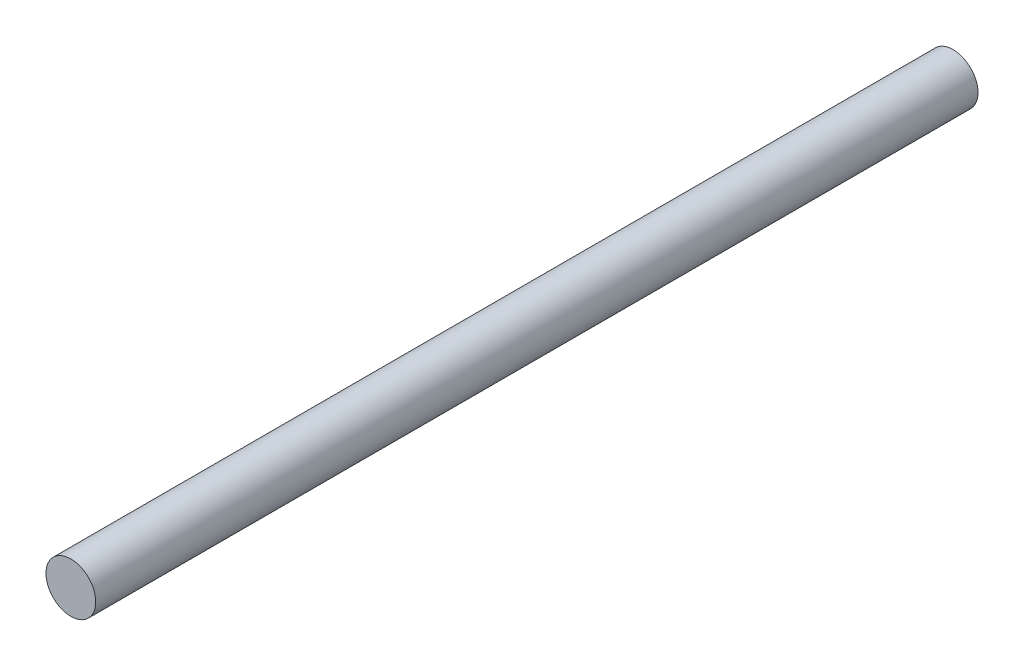
ISO-10303-21;
HEADER;
FILE_DESCRIPTION(('STEP AP214'),'2;1');
FILE_NAME('part.step','',(''),(''),'','','');
FILE_SCHEMA(('AUTOMOTIVE_DESIGN { 1 0 10303 214 1 1 1 1 }'));
ENDSEC;
DATA;
#1=APPLICATION_CONTEXT('core data for automotive mechanical design processes');
#2=APPLICATION_PROTOCOL_DEFINITION('international standard','automotive_design',2000,#1);
#3=PRODUCT_CONTEXT('',#1,'mechanical');
#4=PRODUCT('Part','Part','',(#3));
#5=PRODUCT_RELATED_PRODUCT_CATEGORY('part','',(#4));
#6=PRODUCT_DEFINITION_FORMATION('','',#4);
#7=PRODUCT_DEFINITION_CONTEXT('part definition',#1,'design');
#8=PRODUCT_DEFINITION('design','',#6,#7);
#9=PRODUCT_DEFINITION_SHAPE('','',#8);
#10=(LENGTH_UNIT() NAMED_UNIT(*) SI_UNIT(.MILLI.,.METRE.));
#11=(NAMED_UNIT(*) PLANE_ANGLE_UNIT() SI_UNIT($,.RADIAN.));
#12=(NAMED_UNIT(*) SI_UNIT($,.STERADIAN.) SOLID_ANGLE_UNIT());
#13=UNCERTAINTY_MEASURE_WITH_UNIT(LENGTH_MEASURE(1.E-05),#10,'distance_accuracy_value','');
#14=(GEOMETRIC_REPRESENTATION_CONTEXT(3) GLOBAL_UNCERTAINTY_ASSIGNED_CONTEXT((#13)) GLOBAL_UNIT_ASSIGNED_CONTEXT((#10,
#11,#12)) REPRESENTATION_CONTEXT('',''));
#15=CARTESIAN_POINT('',(0.,0.,0.));
#16=DIRECTION('',(0.,0.,1.));
#17=DIRECTION('',(1.,0.,0.));
#18=AXIS2_PLACEMENT_3D('',#15,#16,#17);
#19=CARTESIAN_POINT('',(0.,0.,225.));
#20=DIRECTION('',(0.,0.,-1.));
#21=DIRECTION('',(-1.,0.,0.));
#22=AXIS2_PLACEMENT_3D('',#19,#20,#21);
#23=CYLINDRICAL_SURFACE('',#22,6.35);
#24=CARTESIAN_POINT('',(0.,0.,225.));
#25=DIRECTION('',(0.,0.,1.));
#26=DIRECTION('',(1.,0.,0.));
#27=AXIS2_PLACEMENT_3D('',#24,#25,#26);
#28=CIRCLE('',#27,6.35);
#29=CARTESIAN_POINT('',(6.35,0.,225.));
#30=VERTEX_POINT('',#29);
#31=EDGE_CURVE('E10',#30,#30,#28,.T.);
#32=ORIENTED_EDGE('',*,*,#31,.F.);
#33=EDGE_LOOP('',(#32));
#34=FACE_BOUND('',#33,.T.);
#35=CARTESIAN_POINT('',(0.,0.,0.));
#36=DIRECTION('',(0.,0.,1.));
#37=DIRECTION('',(1.,0.,0.));
#38=AXIS2_PLACEMENT_3D('',#35,#36,#37);
#39=CIRCLE('',#38,6.35);
#40=CARTESIAN_POINT('',(6.35,0.,0.));
#41=VERTEX_POINT('',#40);
#42=EDGE_CURVE('E42',#41,#41,#39,.T.);
#43=ORIENTED_EDGE('',*,*,#42,.T.);
#44=EDGE_LOOP('',(#43));
#45=FACE_BOUND('',#44,.T.);
#46=ADVANCED_FACE('F39',(#34,#45),#23,.T.);
#47=CARTESIAN_POINT('',(0.,0.,225.));
#48=DIRECTION('',(0.,0.,1.));
#49=DIRECTION('',(1.,0.,0.));
#50=AXIS2_PLACEMENT_3D('',#47,#48,#49);
#51=PLANE('',#50);
#52=ORIENTED_EDGE('',*,*,#31,.T.);
#53=EDGE_LOOP('',(#52));
#54=FACE_BOUND('',#53,.T.);
#55=ADVANCED_FACE('F54',(#54),#51,.T.);
#56=CARTESIAN_POINT('',(0.,0.,0.));
#57=DIRECTION('',(0.,0.,1.));
#58=DIRECTION('',(1.,0.,0.));
#59=AXIS2_PLACEMENT_3D('',#56,#57,#58);
#60=PLANE('',#59);
#61=ORIENTED_EDGE('',*,*,#42,.F.);
#62=EDGE_LOOP('',(#61));
#63=FACE_BOUND('',#62,.T.);
#64=ADVANCED_FACE('F52',(#63),#60,.F.);
#65=CLOSED_SHELL('',(#46,#55,#64));
#66=MANIFOLD_SOLID_BREP('B2',#65);
#67=ADVANCED_BREP_SHAPE_REPRESENTATION('',(#18,#66),#14);
#68=SHAPE_DEFINITION_REPRESENTATION(#9,#67);
ENDSEC;
END-ISO-10303-21;
